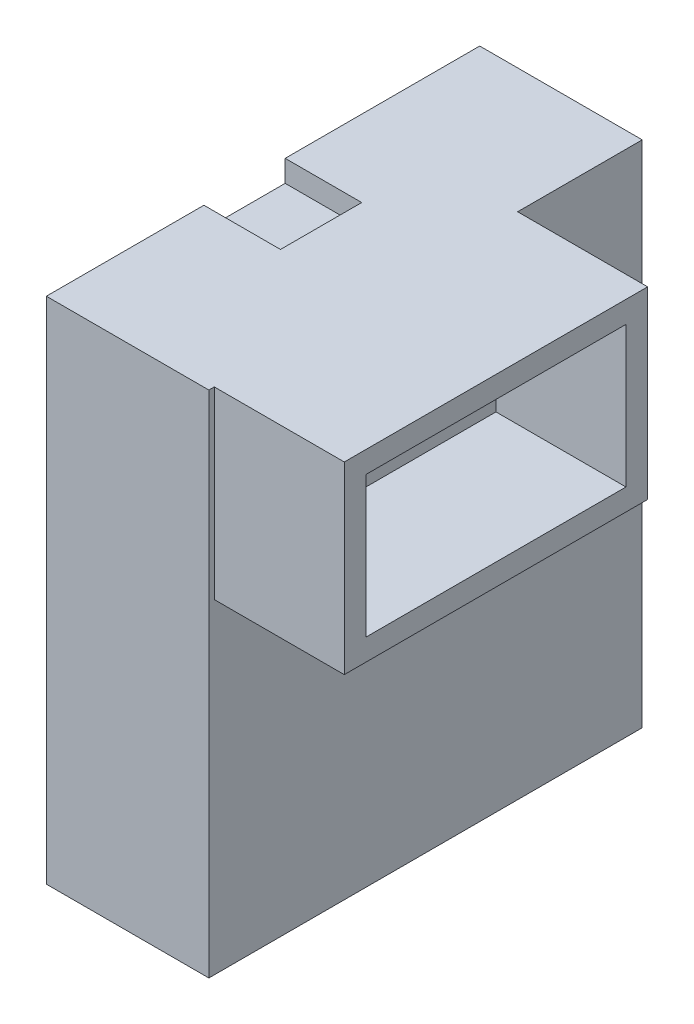
ISO-10303-21;
HEADER;
FILE_DESCRIPTION(('STEP AP214'),'2;1');
FILE_NAME('part.step','',(''),(''),'','','');
FILE_SCHEMA(('AUTOMOTIVE_DESIGN { 1 0 10303 214 1 1 1 1 }'));
ENDSEC;
DATA;
#1=APPLICATION_CONTEXT('core data for automotive mechanical design processes');
#2=APPLICATION_PROTOCOL_DEFINITION('international standard','automotive_design',2000,#1);
#3=PRODUCT_CONTEXT('',#1,'mechanical');
#4=PRODUCT('Part','Part','',(#3));
#5=PRODUCT_RELATED_PRODUCT_CATEGORY('part','',(#4));
#6=PRODUCT_DEFINITION_FORMATION('','',#4);
#7=PRODUCT_DEFINITION_CONTEXT('part definition',#1,'design');
#8=PRODUCT_DEFINITION('design','',#6,#7);
#9=PRODUCT_DEFINITION_SHAPE('','',#8);
#10=(LENGTH_UNIT() NAMED_UNIT(*) SI_UNIT(.MILLI.,.METRE.));
#11=(NAMED_UNIT(*) PLANE_ANGLE_UNIT() SI_UNIT($,.RADIAN.));
#12=(NAMED_UNIT(*) SI_UNIT($,.STERADIAN.) SOLID_ANGLE_UNIT());
#13=UNCERTAINTY_MEASURE_WITH_UNIT(LENGTH_MEASURE(1.E-05),#10,'distance_accuracy_value','');
#14=(GEOMETRIC_REPRESENTATION_CONTEXT(3) GLOBAL_UNCERTAINTY_ASSIGNED_CONTEXT((#13)) GLOBAL_UNIT_ASSIGNED_CONTEXT((#10,
#11,#12)) REPRESENTATION_CONTEXT('',''));
#15=CARTESIAN_POINT('',(0.,0.,0.));
#16=DIRECTION('',(0.,0.,1.));
#17=DIRECTION('',(1.,0.,0.));
#18=AXIS2_PLACEMENT_3D('',#15,#16,#17);
#19=CARTESIAN_POINT('',(15.,0.,0.));
#20=DIRECTION('',(-1.,0.,0.));
#21=DIRECTION('',(0.,0.,1.));
#22=AXIS2_PLACEMENT_3D('',#19,#20,#21);
#23=PLANE('',#22);
#24=DIRECTION('',(0.,-1.,0.));
#25=VECTOR('',#24,1.);
#26=CARTESIAN_POINT('',(15.,23.5,19.5));
#27=LINE('',#26,#25);
#28=CARTESIAN_POINT('',(15.,23.5,19.5));
#29=VERTEX_POINT('',#28);
#30=CARTESIAN_POINT('',(15.,6.5,19.5));
#31=VERTEX_POINT('',#30);
#32=EDGE_CURVE('E214',#29,#31,#27,.T.);
#33=ORIENTED_EDGE('',*,*,#32,.F.);
#34=DIRECTION('',(0.,0.,1.));
#35=VECTOR('',#34,1.);
#36=CARTESIAN_POINT('',(15.,23.5,20.));
#37=LINE('',#36,#35);
#38=CARTESIAN_POINT('',(15.,23.5,20.));
#39=VERTEX_POINT('',#38);
#40=EDGE_CURVE('E245',#29,#39,#37,.T.);
#41=ORIENTED_EDGE('',*,*,#40,.T.);
#42=DIRECTION('',(0.,-1.,0.));
#43=VECTOR('',#42,1.);
#44=CARTESIAN_POINT('',(15.,-23.5,20.));
#45=LINE('',#44,#43);
#46=CARTESIAN_POINT('',(15.,-23.5,20.));
#47=VERTEX_POINT('',#46);
#48=EDGE_CURVE('E249',#39,#47,#45,.T.);
#49=ORIENTED_EDGE('',*,*,#48,.T.);
#50=DIRECTION('',(0.,0.,-1.));
#51=VECTOR('',#50,1.);
#52=CARTESIAN_POINT('',(15.,-23.5,20.));
#53=LINE('',#52,#51);
#54=CARTESIAN_POINT('',(15.,-23.5,-20.));
#55=VERTEX_POINT('',#54);
#56=EDGE_CURVE('E251',#47,#55,#53,.T.);
#57=ORIENTED_EDGE('',*,*,#56,.T.);
#58=DIRECTION('',(0.,1.,0.));
#59=VECTOR('',#58,1.);
#60=CARTESIAN_POINT('',(15.,-23.5,-20.));
#61=LINE('',#60,#59);
#62=CARTESIAN_POINT('',(15.,23.5,-20.));
#63=VERTEX_POINT('',#62);
#64=EDGE_CURVE('E242',#55,#63,#61,.T.);
#65=ORIENTED_EDGE('',*,*,#64,.T.);
#66=CARTESIAN_POINT('',(15.,23.5,-8.5));
#67=VERTEX_POINT('',#66);
#68=EDGE_CURVE('E247',#63,#67,#37,.T.);
#69=ORIENTED_EDGE('',*,*,#68,.T.);
#70=DIRECTION('',(0.,1.,0.));
#71=VECTOR('',#70,1.);
#72=CARTESIAN_POINT('',(15.,23.5,-8.49999999999999));
#73=LINE('',#72,#71);
#74=CARTESIAN_POINT('',(15.,6.5,-8.5));
#75=VERTEX_POINT('',#74);
#76=EDGE_CURVE('E219',#75,#67,#73,.T.);
#77=ORIENTED_EDGE('',*,*,#76,.F.);
#78=DIRECTION('',(0.,0.,-1.));
#79=VECTOR('',#78,1.);
#80=CARTESIAN_POINT('',(15.,6.5,19.5));
#81=LINE('',#80,#79);
#82=EDGE_CURVE('E65',#31,#75,#81,.T.);
#83=ORIENTED_EDGE('',*,*,#82,.F.);
#84=EDGE_LOOP('',(#33,#41,#49,#57,#65,#69,#77,#83));
#85=FACE_BOUND('',#84,.T.);
#86=ADVANCED_FACE('F42',(#85),#23,.F.);
#87=CARTESIAN_POINT('',(15.,-23.5,-20.));
#88=DIRECTION('',(0.,0.,1.));
#89=DIRECTION('',(1.,0.,0.));
#90=AXIS2_PLACEMENT_3D('',#87,#88,#89);
#91=PLANE('',#90);
#92=DIRECTION('',(0.,1.,0.));
#93=VECTOR('',#92,1.);
#94=CARTESIAN_POINT('',(0.,-23.5,-20.));
#95=LINE('',#94,#93);
#96=CARTESIAN_POINT('',(0.,-23.5,-20.));
#97=VERTEX_POINT('',#96);
#98=CARTESIAN_POINT('',(0.,23.5,-20.));
#99=VERTEX_POINT('',#98);
#100=EDGE_CURVE('E241',#97,#99,#95,.T.);
#101=ORIENTED_EDGE('',*,*,#100,.T.);
#102=DIRECTION('',(-1.,0.,0.));
#103=VECTOR('',#102,1.);
#104=CARTESIAN_POINT('',(15.,23.5,-20.));
#105=LINE('',#104,#103);
#106=EDGE_CURVE('E11',#63,#99,#105,.T.);
#107=ORIENTED_EDGE('',*,*,#106,.F.);
#108=ORIENTED_EDGE('',*,*,#64,.F.);
#109=DIRECTION('',(-1.,0.,0.));
#110=VECTOR('',#109,1.);
#111=CARTESIAN_POINT('',(15.,-23.5,-20.));
#112=LINE('',#111,#110);
#113=EDGE_CURVE('E253',#55,#97,#112,.T.);
#114=ORIENTED_EDGE('',*,*,#113,.T.);
#115=EDGE_LOOP('',(#101,#107,#108,#114));
#116=FACE_BOUND('',#115,.T.);
#117=ADVANCED_FACE('F44',(#116),#91,.F.);
#118=CARTESIAN_POINT('',(15.,23.5,20.));
#119=DIRECTION('',(0.,-1.,0.));
#120=DIRECTION('',(0.,0.,-1.));
#121=AXIS2_PLACEMENT_3D('',#118,#119,#120);
#122=PLANE('',#121);
#123=DIRECTION('',(0.,0.,1.));
#124=VECTOR('',#123,1.);
#125=CARTESIAN_POINT('',(0.,23.5,20.));
#126=LINE('',#125,#124);
#127=CARTESIAN_POINT('',(0.,23.5,-2.042260783291));
#128=VERTEX_POINT('',#127);
#129=EDGE_CURVE('E256',#99,#128,#126,.T.);
#130=ORIENTED_EDGE('',*,*,#129,.T.);
#131=DIRECTION('',(-1.,0.,0.));
#132=VECTOR('',#131,1.);
#133=CARTESIAN_POINT('',(0.,23.5,-2.042260783291));
#134=LINE('',#133,#132);
#135=CARTESIAN_POINT('',(7.0674050031645,23.5,-2.042260783291));
#136=VERTEX_POINT('',#135);
#137=EDGE_CURVE('E171',#136,#128,#134,.T.);
#138=ORIENTED_EDGE('',*,*,#137,.F.);
#139=DIRECTION('',(0.,0.,-1.));
#140=VECTOR('',#139,1.);
#141=CARTESIAN_POINT('',(7.0674050031645,23.5,5.457739216709));
#142=LINE('',#141,#140);
#143=CARTESIAN_POINT('',(7.0674050031645,23.5,5.457739216709));
#144=VERTEX_POINT('',#143);
#145=EDGE_CURVE('E498',#144,#136,#142,.T.);
#146=ORIENTED_EDGE('',*,*,#145,.F.);
#147=DIRECTION('',(1.,0.,0.));
#148=VECTOR('',#147,1.);
#149=CARTESIAN_POINT('',(0.,23.5,5.457739216709));
#150=LINE('',#149,#148);
#151=CARTESIAN_POINT('',(0.,23.5,5.457739216709));
#152=VERTEX_POINT('',#151);
#153=EDGE_CURVE('E500',#152,#144,#150,.T.);
#154=ORIENTED_EDGE('',*,*,#153,.F.);
#155=CARTESIAN_POINT('',(0.,23.5,20.));
#156=VERTEX_POINT('',#155);
#157=EDGE_CURVE('E176',#152,#156,#126,.T.);
#158=ORIENTED_EDGE('',*,*,#157,.T.);
#159=DIRECTION('',(-1.,0.,0.));
#160=VECTOR('',#159,1.);
#161=CARTESIAN_POINT('',(15.,23.5,20.));
#162=LINE('',#161,#160);
#163=EDGE_CURVE('E50',#39,#156,#162,.T.);
#164=ORIENTED_EDGE('',*,*,#163,.F.);
#165=ORIENTED_EDGE('',*,*,#40,.F.);
#166=DIRECTION('',(-1.,0.,0.));
#167=VECTOR('',#166,1.);
#168=CARTESIAN_POINT('',(27.,23.5,19.5));
#169=LINE('',#168,#167);
#170=CARTESIAN_POINT('',(27.,23.5,19.5));
#171=VERTEX_POINT('',#170);
#172=EDGE_CURVE('E225',#171,#29,#169,.T.);
#173=ORIENTED_EDGE('',*,*,#172,.F.);
#174=DIRECTION('',(0.,0.,1.));
#175=VECTOR('',#174,1.);
#176=CARTESIAN_POINT('',(27.,23.5,19.5));
#177=LINE('',#176,#175);
#178=CARTESIAN_POINT('',(27.,23.5,-8.49999999999999));
#179=VERTEX_POINT('',#178);
#180=EDGE_CURVE('E223',#179,#171,#177,.T.);
#181=ORIENTED_EDGE('',*,*,#180,.F.);
#182=DIRECTION('',(-1.,0.,0.));
#183=VECTOR('',#182,1.);
#184=CARTESIAN_POINT('',(27.,23.5,-8.49999999999999));
#185=LINE('',#184,#183);
#186=EDGE_CURVE('E233',#179,#67,#185,.T.);
#187=ORIENTED_EDGE('',*,*,#186,.T.);
#188=ORIENTED_EDGE('',*,*,#68,.F.);
#189=ORIENTED_EDGE('',*,*,#106,.T.);
#190=EDGE_LOOP('',(#130,#138,#146,#154,#158,#164,#165,#173,#181,#187,#188,#189));
#191=FACE_BOUND('',#190,.T.);
#192=ADVANCED_FACE('F284',(#191),#122,.F.);
#193=CARTESIAN_POINT('',(15.,-23.5,20.));
#194=DIRECTION('',(0.,0.,-1.));
#195=DIRECTION('',(-1.,0.,0.));
#196=AXIS2_PLACEMENT_3D('',#193,#194,#195);
#197=PLANE('',#196);
#198=DIRECTION('',(0.,-1.,0.));
#199=VECTOR('',#198,1.);
#200=CARTESIAN_POINT('',(0.,-23.5,20.));
#201=LINE('',#200,#199);
#202=CARTESIAN_POINT('',(0.,-23.5,20.));
#203=VERTEX_POINT('',#202);
#204=EDGE_CURVE('E259',#156,#203,#201,.T.);
#205=ORIENTED_EDGE('',*,*,#204,.T.);
#206=DIRECTION('',(-1.,0.,0.));
#207=VECTOR('',#206,1.);
#208=CARTESIAN_POINT('',(15.,-23.5,20.));
#209=LINE('',#208,#207);
#210=EDGE_CURVE('E264',#47,#203,#209,.T.);
#211=ORIENTED_EDGE('',*,*,#210,.F.);
#212=ORIENTED_EDGE('',*,*,#48,.F.);
#213=ORIENTED_EDGE('',*,*,#163,.T.);
#214=EDGE_LOOP('',(#205,#211,#212,#213));
#215=FACE_BOUND('',#214,.T.);
#216=ADVANCED_FACE('F270',(#215),#197,.F.);
#217=CARTESIAN_POINT('',(15.,-23.5,20.));
#218=DIRECTION('',(0.,1.,0.));
#219=DIRECTION('',(0.,0.,1.));
#220=AXIS2_PLACEMENT_3D('',#217,#218,#219);
#221=PLANE('',#220);
#222=DIRECTION('',(0.,0.,-1.));
#223=VECTOR('',#222,1.);
#224=CARTESIAN_POINT('',(0.,-23.5,20.));
#225=LINE('',#224,#223);
#226=EDGE_CURVE('E246',#203,#97,#225,.T.);
#227=ORIENTED_EDGE('',*,*,#226,.T.);
#228=ORIENTED_EDGE('',*,*,#113,.F.);
#229=ORIENTED_EDGE('',*,*,#56,.F.);
#230=ORIENTED_EDGE('',*,*,#210,.T.);
#231=EDGE_LOOP('',(#227,#228,#229,#230));
#232=FACE_BOUND('',#231,.T.);
#233=ADVANCED_FACE('F278',(#232),#221,.F.);
#234=CARTESIAN_POINT('',(0.,0.,0.));
#235=DIRECTION('',(-1.,0.,0.));
#236=DIRECTION('',(0.,0.,1.));
#237=AXIS2_PLACEMENT_3D('',#234,#235,#236);
#238=PLANE('',#237);
#239=DIRECTION('',(0.,1.,0.));
#240=VECTOR('',#239,1.);
#241=CARTESIAN_POINT('',(0.,21.5,-2.042260783291));
#242=LINE('',#241,#240);
#243=CARTESIAN_POINT('',(0.,21.5,-2.042260783291));
#244=VERTEX_POINT('',#243);
#245=EDGE_CURVE('E198',#244,#128,#242,.T.);
#246=ORIENTED_EDGE('',*,*,#245,.T.);
#247=ORIENTED_EDGE('',*,*,#129,.F.);
#248=ORIENTED_EDGE('',*,*,#100,.F.);
#249=ORIENTED_EDGE('',*,*,#226,.F.);
#250=ORIENTED_EDGE('',*,*,#204,.F.);
#251=ORIENTED_EDGE('',*,*,#157,.F.);
#252=DIRECTION('',(0.,1.,0.));
#253=VECTOR('',#252,1.);
#254=CARTESIAN_POINT('',(0.,21.5,5.457739216709));
#255=LINE('',#254,#253);
#256=CARTESIAN_POINT('',(0.,21.5,5.457739216709));
#257=VERTEX_POINT('',#256);
#258=EDGE_CURVE('E160',#257,#152,#255,.T.);
#259=ORIENTED_EDGE('',*,*,#258,.F.);
#260=DIRECTION('',(0.,0.,1.));
#261=VECTOR('',#260,1.);
#262=CARTESIAN_POINT('',(0.,21.5,5.457739216709));
#263=LINE('',#262,#261);
#264=EDGE_CURVE('E165',#244,#257,#263,.T.);
#265=ORIENTED_EDGE('',*,*,#264,.F.);
#266=EDGE_LOOP('',(#246,#247,#248,#249,#250,#251,#259,#265));
#267=FACE_BOUND('',#266,.T.);
#268=ADVANCED_FACE('F174',(#267),#238,.T.);
#269=CARTESIAN_POINT('',(27.,0.,0.));
#270=DIRECTION('',(1.,0.,0.));
#271=DIRECTION('',(0.,0.,-1.));
#272=AXIS2_PLACEMENT_3D('',#269,#270,#271);
#273=PLANE('',#272);
#274=DIRECTION('',(0.,-1.,0.));
#275=VECTOR('',#274,1.);
#276=CARTESIAN_POINT('',(27.,23.5,19.5));
#277=LINE('',#276,#275);
#278=CARTESIAN_POINT('',(27.,6.5,19.5));
#279=VERTEX_POINT('',#278);
#280=EDGE_CURVE('E215',#171,#279,#277,.T.);
#281=ORIENTED_EDGE('',*,*,#280,.T.);
#282=DIRECTION('',(0.,0.,-1.));
#283=VECTOR('',#282,1.);
#284=CARTESIAN_POINT('',(27.,6.5,19.5));
#285=LINE('',#284,#283);
#286=CARTESIAN_POINT('',(27.,6.5,-8.5));
#287=VERTEX_POINT('',#286);
#288=EDGE_CURVE('E218',#279,#287,#285,.T.);
#289=ORIENTED_EDGE('',*,*,#288,.T.);
#290=DIRECTION('',(0.,1.,0.));
#291=VECTOR('',#290,1.);
#292=CARTESIAN_POINT('',(27.,23.5,-8.49999999999999));
#293=LINE('',#292,#291);
#294=EDGE_CURVE('E221',#287,#179,#293,.T.);
#295=ORIENTED_EDGE('',*,*,#294,.T.);
#296=ORIENTED_EDGE('',*,*,#180,.T.);
#297=EDGE_LOOP('',(#281,#289,#295,#296));
#298=FACE_BOUND('',#297,.T.);
#299=DIRECTION('',(0.,0.,1.));
#300=VECTOR('',#299,1.);
#301=CARTESIAN_POINT('',(27.,21.5,17.5));
#302=LINE('',#301,#300);
#303=CARTESIAN_POINT('',(27.,21.5,-6.5));
#304=VERTEX_POINT('',#303);
#305=CARTESIAN_POINT('',(27.,21.5,17.5));
#306=VERTEX_POINT('',#305);
#307=EDGE_CURVE('E185',#304,#306,#302,.T.);
#308=ORIENTED_EDGE('',*,*,#307,.F.);
#309=DIRECTION('',(0.,1.,0.));
#310=VECTOR('',#309,1.);
#311=CARTESIAN_POINT('',(27.,21.5,-6.5));
#312=LINE('',#311,#310);
#313=CARTESIAN_POINT('',(27.,8.5,-6.5));
#314=VERTEX_POINT('',#313);
#315=EDGE_CURVE('E183',#314,#304,#312,.T.);
#316=ORIENTED_EDGE('',*,*,#315,.F.);
#317=DIRECTION('',(0.,0.,-1.));
#318=VECTOR('',#317,1.);
#319=CARTESIAN_POINT('',(27.,8.5,17.5));
#320=LINE('',#319,#318);
#321=CARTESIAN_POINT('',(27.,8.5,17.5));
#322=VERTEX_POINT('',#321);
#323=EDGE_CURVE('E191',#322,#314,#320,.T.);
#324=ORIENTED_EDGE('',*,*,#323,.F.);
#325=DIRECTION('',(0.,-1.,0.));
#326=VECTOR('',#325,1.);
#327=CARTESIAN_POINT('',(27.,21.5,17.5));
#328=LINE('',#327,#326);
#329=EDGE_CURVE('E188',#306,#322,#328,.T.);
#330=ORIENTED_EDGE('',*,*,#329,.F.);
#331=EDGE_LOOP('',(#308,#316,#324,#330));
#332=FACE_BOUND('',#331,.T.);
#333=ADVANCED_FACE('F291',(#298,#332),#273,.T.);
#334=CARTESIAN_POINT('',(27.,23.5,19.5));
#335=DIRECTION('',(0.,0.,-1.));
#336=DIRECTION('',(0.,1.,0.));
#337=AXIS2_PLACEMENT_3D('',#334,#335,#336);
#338=PLANE('',#337);
#339=ORIENTED_EDGE('',*,*,#32,.T.);
#340=DIRECTION('',(-1.,0.,0.));
#341=VECTOR('',#340,1.);
#342=CARTESIAN_POINT('',(27.,6.5,19.5));
#343=LINE('',#342,#341);
#344=EDGE_CURVE('E239',#279,#31,#343,.T.);
#345=ORIENTED_EDGE('',*,*,#344,.F.);
#346=ORIENTED_EDGE('',*,*,#280,.F.);
#347=ORIENTED_EDGE('',*,*,#172,.T.);
#348=EDGE_LOOP('',(#339,#345,#346,#347));
#349=FACE_BOUND('',#348,.T.);
#350=ADVANCED_FACE('F288',(#349),#338,.F.);
#351=CARTESIAN_POINT('',(27.,6.5,19.5));
#352=DIRECTION('',(0.,1.,0.));
#353=DIRECTION('',(0.,0.,1.));
#354=AXIS2_PLACEMENT_3D('',#351,#352,#353);
#355=PLANE('',#354);
#356=ORIENTED_EDGE('',*,*,#82,.T.);
#357=DIRECTION('',(-1.,0.,0.));
#358=VECTOR('',#357,1.);
#359=CARTESIAN_POINT('',(27.,6.5,-8.5));
#360=LINE('',#359,#358);
#361=EDGE_CURVE('E236',#287,#75,#360,.T.);
#362=ORIENTED_EDGE('',*,*,#361,.F.);
#363=ORIENTED_EDGE('',*,*,#288,.F.);
#364=ORIENTED_EDGE('',*,*,#344,.T.);
#365=EDGE_LOOP('',(#356,#362,#363,#364));
#366=FACE_BOUND('',#365,.T.);
#367=ADVANCED_FACE('F299',(#366),#355,.F.);
#368=CARTESIAN_POINT('',(27.,23.5,-8.49999999999999));
#369=DIRECTION('',(0.,0.,1.));
#370=DIRECTION('',(0.,-1.,0.));
#371=AXIS2_PLACEMENT_3D('',#368,#369,#370);
#372=PLANE('',#371);
#373=ORIENTED_EDGE('',*,*,#76,.T.);
#374=ORIENTED_EDGE('',*,*,#186,.F.);
#375=ORIENTED_EDGE('',*,*,#294,.F.);
#376=ORIENTED_EDGE('',*,*,#361,.T.);
#377=EDGE_LOOP('',(#373,#374,#375,#376));
#378=FACE_BOUND('',#377,.T.);
#379=ADVANCED_FACE('F297',(#378),#372,.F.);
#380=CARTESIAN_POINT('',(27.,21.5,-6.5));
#381=DIRECTION('',(0.,0.,1.));
#382=DIRECTION('',(0.,-1.,0.));
#383=AXIS2_PLACEMENT_3D('',#380,#381,#382);
#384=PLANE('',#383);
#385=DIRECTION('',(0.,1.,0.));
#386=VECTOR('',#385,1.);
#387=CARTESIAN_POINT('',(15.,21.5,-6.5));
#388=LINE('',#387,#386);
#389=CARTESIAN_POINT('',(15.,8.5,-6.5));
#390=VERTEX_POINT('',#389);
#391=CARTESIAN_POINT('',(15.,21.5,-6.5));
#392=VERTEX_POINT('',#391);
#393=EDGE_CURVE('E194',#390,#392,#388,.T.);
#394=ORIENTED_EDGE('',*,*,#393,.F.);
#395=DIRECTION('',(-1.,0.,0.));
#396=VECTOR('',#395,1.);
#397=CARTESIAN_POINT('',(27.,8.5,-6.5));
#398=LINE('',#397,#396);
#399=EDGE_CURVE('E193',#314,#390,#398,.T.);
#400=ORIENTED_EDGE('',*,*,#399,.F.);
#401=ORIENTED_EDGE('',*,*,#315,.T.);
#402=DIRECTION('',(-1.,0.,0.));
#403=VECTOR('',#402,1.);
#404=CARTESIAN_POINT('',(27.,21.5,-6.5));
#405=LINE('',#404,#403);
#406=EDGE_CURVE('E211',#304,#392,#405,.T.);
#407=ORIENTED_EDGE('',*,*,#406,.T.);
#408=EDGE_LOOP('',(#394,#400,#401,#407));
#409=FACE_BOUND('',#408,.T.);
#410=ADVANCED_FACE('F306',(#409),#384,.T.);
#411=CARTESIAN_POINT('',(27.,21.5,17.5));
#412=DIRECTION('',(0.,-1.,0.));
#413=DIRECTION('',(0.,0.,-1.));
#414=AXIS2_PLACEMENT_3D('',#411,#412,#413);
#415=PLANE('',#414);
#416=DIRECTION('',(0.,0.,1.));
#417=VECTOR('',#416,1.);
#418=CARTESIAN_POINT('',(15.,21.5,17.5));
#419=LINE('',#418,#417);
#420=CARTESIAN_POINT('',(15.,21.5,17.5));
#421=VERTEX_POINT('',#420);
#422=EDGE_CURVE('E197',#392,#421,#419,.T.);
#423=ORIENTED_EDGE('',*,*,#422,.F.);
#424=ORIENTED_EDGE('',*,*,#406,.F.);
#425=ORIENTED_EDGE('',*,*,#307,.T.);
#426=DIRECTION('',(-1.,0.,0.));
#427=VECTOR('',#426,1.);
#428=CARTESIAN_POINT('',(27.,21.5,17.5));
#429=LINE('',#428,#427);
#430=EDGE_CURVE('E209',#306,#421,#429,.T.);
#431=ORIENTED_EDGE('',*,*,#430,.T.);
#432=EDGE_LOOP('',(#423,#424,#425,#431));
#433=FACE_BOUND('',#432,.T.);
#434=ADVANCED_FACE('F340',(#433),#415,.T.);
#435=CARTESIAN_POINT('',(27.,21.5,17.5));
#436=DIRECTION('',(0.,0.,-1.));
#437=DIRECTION('',(-1.,0.,0.));
#438=AXIS2_PLACEMENT_3D('',#435,#436,#437);
#439=PLANE('',#438);
#440=DIRECTION('',(0.,-1.,0.));
#441=VECTOR('',#440,1.);
#442=CARTESIAN_POINT('',(15.,21.5,17.5));
#443=LINE('',#442,#441);
#444=CARTESIAN_POINT('',(15.,8.5,17.5));
#445=VERTEX_POINT('',#444);
#446=EDGE_CURVE('E201',#421,#445,#443,.T.);
#447=ORIENTED_EDGE('',*,*,#446,.F.);
#448=ORIENTED_EDGE('',*,*,#430,.F.);
#449=ORIENTED_EDGE('',*,*,#329,.T.);
#450=DIRECTION('',(-1.,0.,0.));
#451=VECTOR('',#450,1.);
#452=CARTESIAN_POINT('',(27.,8.5,17.5));
#453=LINE('',#452,#451);
#454=EDGE_CURVE('E207',#322,#445,#453,.T.);
#455=ORIENTED_EDGE('',*,*,#454,.T.);
#456=EDGE_LOOP('',(#447,#448,#449,#455));
#457=FACE_BOUND('',#456,.T.);
#458=ADVANCED_FACE('F327',(#457),#439,.T.);
#459=CARTESIAN_POINT('',(27.,8.5,17.5));
#460=DIRECTION('',(0.,1.,0.));
#461=DIRECTION('',(0.,0.,1.));
#462=AXIS2_PLACEMENT_3D('',#459,#460,#461);
#463=PLANE('',#462);
#464=DIRECTION('',(0.,0.,-1.));
#465=VECTOR('',#464,1.);
#466=CARTESIAN_POINT('',(15.,8.5,17.5));
#467=LINE('',#466,#465);
#468=EDGE_CURVE('E186',#445,#390,#467,.T.);
#469=ORIENTED_EDGE('',*,*,#468,.F.);
#470=ORIENTED_EDGE('',*,*,#454,.F.);
#471=ORIENTED_EDGE('',*,*,#323,.T.);
#472=ORIENTED_EDGE('',*,*,#399,.T.);
#473=EDGE_LOOP('',(#469,#470,#471,#472));
#474=FACE_BOUND('',#473,.T.);
#475=ADVANCED_FACE('F318',(#474),#463,.T.);
#476=ORIENTED_EDGE('',*,*,#468,.T.);
#477=ORIENTED_EDGE('',*,*,#393,.T.);
#478=ORIENTED_EDGE('',*,*,#422,.T.);
#479=ORIENTED_EDGE('',*,*,#446,.T.);
#480=EDGE_LOOP('',(#476,#477,#478,#479));
#481=FACE_BOUND('',#480,.T.);
#482=ADVANCED_FACE('F311',(#481),#23,.F.);
#483=CARTESIAN_POINT('',(0.,21.5,-2.042260783291));
#484=DIRECTION('',(0.,0.,-1.));
#485=DIRECTION('',(-1.,0.,0.));
#486=AXIS2_PLACEMENT_3D('',#483,#484,#485);
#487=PLANE('',#486);
#488=ORIENTED_EDGE('',*,*,#137,.T.);
#489=ORIENTED_EDGE('',*,*,#245,.F.);
#490=DIRECTION('',(-1.,0.,0.));
#491=VECTOR('',#490,1.);
#492=CARTESIAN_POINT('',(0.,21.5,-2.042260783291));
#493=LINE('',#492,#491);
#494=CARTESIAN_POINT('',(7.0674050031645,21.5,-2.042260783291));
#495=VERTEX_POINT('',#494);
#496=EDGE_CURVE('E57',#495,#244,#493,.T.);
#497=ORIENTED_EDGE('',*,*,#496,.F.);
#498=DIRECTION('',(0.,1.,0.));
#499=VECTOR('',#498,1.);
#500=CARTESIAN_POINT('',(7.0674050031645,21.5,-2.042260783291));
#501=LINE('',#500,#499);
#502=EDGE_CURVE('E178',#495,#136,#501,.T.);
#503=ORIENTED_EDGE('',*,*,#502,.T.);
#504=EDGE_LOOP('',(#488,#489,#497,#503));
#505=FACE_BOUND('',#504,.T.);
#506=ADVANCED_FACE('F317',(#505),#487,.F.);
#507=CARTESIAN_POINT('',(7.0674050031645,21.5,5.457739216709));
#508=DIRECTION('',(1.,0.,0.));
#509=DIRECTION('',(0.,0.,-1.));
#510=AXIS2_PLACEMENT_3D('',#507,#508,#509);
#511=PLANE('',#510);
#512=ORIENTED_EDGE('',*,*,#145,.T.);
#513=ORIENTED_EDGE('',*,*,#502,.F.);
#514=DIRECTION('',(0.,0.,-1.));
#515=VECTOR('',#514,1.);
#516=CARTESIAN_POINT('',(7.0674050031645,21.5,5.457739216709));
#517=LINE('',#516,#515);
#518=CARTESIAN_POINT('',(7.0674050031645,21.5,5.457739216709));
#519=VERTEX_POINT('',#518);
#520=EDGE_CURVE('E164',#519,#495,#517,.T.);
#521=ORIENTED_EDGE('',*,*,#520,.F.);
#522=DIRECTION('',(0.,1.,0.));
#523=VECTOR('',#522,1.);
#524=CARTESIAN_POINT('',(7.0674050031645,21.5,5.457739216709));
#525=LINE('',#524,#523);
#526=EDGE_CURVE('E162',#519,#144,#525,.T.);
#527=ORIENTED_EDGE('',*,*,#526,.T.);
#528=EDGE_LOOP('',(#512,#513,#521,#527));
#529=FACE_BOUND('',#528,.T.);
#530=ADVANCED_FACE('F324',(#529),#511,.F.);
#531=CARTESIAN_POINT('',(0.,21.5,5.457739216709));
#532=DIRECTION('',(0.,0.,1.));
#533=DIRECTION('',(1.,0.,0.));
#534=AXIS2_PLACEMENT_3D('',#531,#532,#533);
#535=PLANE('',#534);
#536=ORIENTED_EDGE('',*,*,#153,.T.);
#537=ORIENTED_EDGE('',*,*,#526,.F.);
#538=DIRECTION('',(1.,0.,0.));
#539=VECTOR('',#538,1.);
#540=CARTESIAN_POINT('',(0.,21.5,5.457739216709));
#541=LINE('',#540,#539);
#542=EDGE_CURVE('E156',#257,#519,#541,.T.);
#543=ORIENTED_EDGE('',*,*,#542,.F.);
#544=ORIENTED_EDGE('',*,*,#258,.T.);
#545=EDGE_LOOP('',(#536,#537,#543,#544));
#546=FACE_BOUND('',#545,.T.);
#547=ADVANCED_FACE('F158',(#546),#535,.F.);
#548=CARTESIAN_POINT('',(0.,21.5,0.));
#549=DIRECTION('',(0.,-1.,0.));
#550=DIRECTION('',(0.,0.,-1.));
#551=AXIS2_PLACEMENT_3D('',#548,#549,#550);
#552=PLANE('',#551);
#553=ORIENTED_EDGE('',*,*,#264,.T.);
#554=ORIENTED_EDGE('',*,*,#542,.T.);
#555=ORIENTED_EDGE('',*,*,#520,.T.);
#556=ORIENTED_EDGE('',*,*,#496,.T.);
#557=EDGE_LOOP('',(#553,#554,#555,#556));
#558=FACE_BOUND('',#557,.T.);
#559=ADVANCED_FACE('F168',(#558),#552,.F.);
#560=CLOSED_SHELL('',(#86,#117,#192,#216,#233,#268,#333,#350,#367,#379,#410,#434,#458,#475,#482,
#506,#530,#547,#559));
#561=MANIFOLD_SOLID_BREP('B2',#560);
#562=ADVANCED_BREP_SHAPE_REPRESENTATION('',(#18,#561),#14);
#563=SHAPE_DEFINITION_REPRESENTATION(#9,#562);
ENDSEC;
END-ISO-10303-21;
